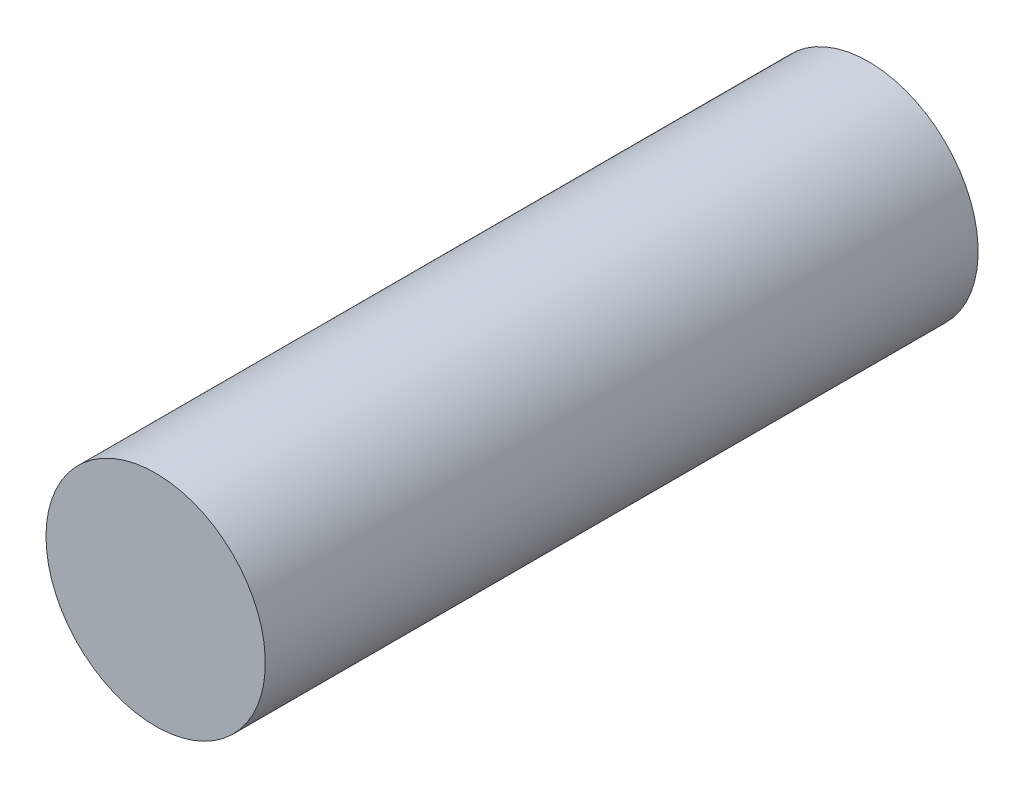
ISO-10303-21;
HEADER;
FILE_DESCRIPTION(('STEP AP214'),'2;1');
FILE_NAME('part.step','',(''),(''),'','','');
FILE_SCHEMA(('AUTOMOTIVE_DESIGN { 1 0 10303 214 1 1 1 1 }'));
ENDSEC;
DATA;
#1=APPLICATION_CONTEXT('core data for automotive mechanical design processes');
#2=APPLICATION_PROTOCOL_DEFINITION('international standard','automotive_design',2000,#1);
#3=PRODUCT_CONTEXT('',#1,'mechanical');
#4=PRODUCT('Part','Part','',(#3));
#5=PRODUCT_RELATED_PRODUCT_CATEGORY('part','',(#4));
#6=PRODUCT_DEFINITION_FORMATION('','',#4);
#7=PRODUCT_DEFINITION_CONTEXT('part definition',#1,'design');
#8=PRODUCT_DEFINITION('design','',#6,#7);
#9=PRODUCT_DEFINITION_SHAPE('','',#8);
#10=(LENGTH_UNIT() NAMED_UNIT(*) SI_UNIT(.MILLI.,.METRE.));
#11=(NAMED_UNIT(*) PLANE_ANGLE_UNIT() SI_UNIT($,.RADIAN.));
#12=(NAMED_UNIT(*) SI_UNIT($,.STERADIAN.) SOLID_ANGLE_UNIT());
#13=UNCERTAINTY_MEASURE_WITH_UNIT(LENGTH_MEASURE(1.E-05),#10,'distance_accuracy_value','');
#14=(GEOMETRIC_REPRESENTATION_CONTEXT(3) GLOBAL_UNCERTAINTY_ASSIGNED_CONTEXT((#13)) GLOBAL_UNIT_ASSIGNED_CONTEXT((#10,
#11,#12)) REPRESENTATION_CONTEXT('',''));
#15=CARTESIAN_POINT('',(0.,0.,0.));
#16=DIRECTION('',(0.,0.,1.));
#17=DIRECTION('',(1.,0.,0.));
#18=AXIS2_PLACEMENT_3D('',#15,#16,#17);
#19=CARTESIAN_POINT('',(0.,0.,26.));
#20=DIRECTION('',(0.,0.,-1.));
#21=DIRECTION('',(-1.,0.,0.));
#22=AXIS2_PLACEMENT_3D('',#19,#20,#21);
#23=CYLINDRICAL_SURFACE('',#22,4.);
#24=CARTESIAN_POINT('',(0.,0.,26.));
#25=DIRECTION('',(0.,0.,1.));
#26=DIRECTION('',(1.,0.,0.));
#27=AXIS2_PLACEMENT_3D('',#24,#25,#26);
#28=CIRCLE('',#27,4.);
#29=CARTESIAN_POINT('',(-4.,0.,26.));
#30=VERTEX_POINT('',#29);
#31=EDGE_CURVE('E10',#30,#30,#28,.T.);
#32=CARTESIAN_POINT('',(0.,0.,0.));
#33=DIRECTION('',(0.,0.,1.));
#34=DIRECTION('',(1.,0.,0.));
#35=AXIS2_PLACEMENT_3D('',#32,#33,#34);
#36=CIRCLE('',#35,4.);
#37=CARTESIAN_POINT('',(-4.,0.,0.));
#38=VERTEX_POINT('',#37);
#39=EDGE_CURVE('E39',#38,#38,#36,.T.);
#40=CARTESIAN_POINT('',(-4.,0.,26.));
#41=CARTESIAN_POINT('',(-4.,0.,25.7291666666667));
#42=CARTESIAN_POINT('',(-4.,0.,25.4583333333333));
#43=CARTESIAN_POINT('',(-4.,0.,24.9166666666667));
#44=CARTESIAN_POINT('',(-4.,0.,24.6458333333333));
#45=CARTESIAN_POINT('',(-4.,0.,24.1041666666667));
#46=CARTESIAN_POINT('',(-4.,0.,23.8333333333333));
#47=CARTESIAN_POINT('',(-4.,0.,23.2916666666667));
#48=CARTESIAN_POINT('',(-4.,0.,23.0208333333333));
#49=CARTESIAN_POINT('',(-4.,0.,22.4791666666667));
#50=CARTESIAN_POINT('',(-4.,0.,22.2083333333333));
#51=CARTESIAN_POINT('',(-4.,0.,21.6666666666667));
#52=CARTESIAN_POINT('',(-4.,0.,21.3958333333333));
#53=CARTESIAN_POINT('',(-4.,0.,20.8541666666667));
#54=CARTESIAN_POINT('',(-4.,0.,20.5833333333333));
#55=CARTESIAN_POINT('',(-4.,0.,20.0416666666667));
#56=CARTESIAN_POINT('',(-4.,0.,19.7708333333333));
#57=CARTESIAN_POINT('',(-4.,0.,19.2291666666667));
#58=CARTESIAN_POINT('',(-4.,0.,18.9583333333333));
#59=CARTESIAN_POINT('',(-4.,0.,18.4166666666667));
#60=CARTESIAN_POINT('',(-4.,0.,18.1458333333333));
#61=CARTESIAN_POINT('',(-4.,0.,17.6041666666667));
#62=CARTESIAN_POINT('',(-4.,0.,17.3333333333333));
#63=CARTESIAN_POINT('',(-4.,0.,16.7916666666667));
#64=CARTESIAN_POINT('',(-4.,0.,16.5208333333333));
#65=CARTESIAN_POINT('',(-4.,0.,15.9791666666667));
#66=CARTESIAN_POINT('',(-4.,0.,15.7083333333333));
#67=CARTESIAN_POINT('',(-4.,0.,15.1666666666667));
#68=CARTESIAN_POINT('',(-4.,0.,14.8958333333333));
#69=CARTESIAN_POINT('',(-4.,0.,14.3541666666667));
#70=CARTESIAN_POINT('',(-4.,0.,14.0833333333333));
#71=CARTESIAN_POINT('',(-4.,0.,13.5416666666667));
#72=CARTESIAN_POINT('',(-4.,0.,13.2708333333333));
#73=CARTESIAN_POINT('',(-4.,0.,12.7291666666667));
#74=CARTESIAN_POINT('',(-4.,0.,12.4583333333333));
#75=CARTESIAN_POINT('',(-4.,0.,11.9166666666667));
#76=CARTESIAN_POINT('',(-4.,0.,11.6458333333333));
#77=CARTESIAN_POINT('',(-4.,0.,11.1041666666667));
#78=CARTESIAN_POINT('',(-4.,0.,10.8333333333333));
#79=CARTESIAN_POINT('',(-4.,0.,10.2916666666667));
#80=CARTESIAN_POINT('',(-4.,0.,10.0208333333333));
#81=CARTESIAN_POINT('',(-4.,0.,9.47916666666667));
#82=CARTESIAN_POINT('',(-4.,0.,9.20833333333333));
#83=CARTESIAN_POINT('',(-4.,0.,8.66666666666667));
#84=CARTESIAN_POINT('',(-4.,0.,8.39583333333333));
#85=CARTESIAN_POINT('',(-4.,0.,7.85416666666667));
#86=CARTESIAN_POINT('',(-4.,0.,7.58333333333333));
#87=CARTESIAN_POINT('',(-4.,0.,7.04166666666667));
#88=CARTESIAN_POINT('',(-4.,0.,6.77083333333333));
#89=CARTESIAN_POINT('',(-4.,0.,6.22916666666667));
#90=CARTESIAN_POINT('',(-4.,0.,5.95833333333333));
#91=CARTESIAN_POINT('',(-4.,0.,5.41666666666667));
#92=CARTESIAN_POINT('',(-4.,0.,5.14583333333333));
#93=CARTESIAN_POINT('',(-4.,0.,4.60416666666667));
#94=CARTESIAN_POINT('',(-4.,0.,4.33333333333333));
#95=CARTESIAN_POINT('',(-4.,0.,3.79166666666667));
#96=CARTESIAN_POINT('',(-4.,0.,3.52083333333333));
#97=CARTESIAN_POINT('',(-4.,0.,2.97916666666667));
#98=CARTESIAN_POINT('',(-4.,0.,2.70833333333333));
#99=CARTESIAN_POINT('',(-4.,0.,2.16666666666667));
#100=CARTESIAN_POINT('',(-4.,0.,1.89583333333333));
#101=CARTESIAN_POINT('',(-4.,0.,1.35416666666667));
#102=CARTESIAN_POINT('',(-4.,0.,1.08333333333333));
#103=CARTESIAN_POINT('',(-4.,0.,0.541666666666667));
#104=CARTESIAN_POINT('',(-4.,0.,0.270833333333334));
#105=CARTESIAN_POINT('',(-4.,0.,0.));
#106=B_SPLINE_CURVE_WITH_KNOTS('',3,(#40,#41,#42,#43,#44,#45,#46,#47,#48,#49,#50,#51,#52,#53,
#54,#55,#56,#57,#58,#59,#60,#61,#62,#63,#64,#65,#66,#67,#68,#69,#70,#71,#72,#73,#74,#75,#76,#77,
#78,#79,#80,#81,#82,#83,#84,#85,#86,#87,#88,#89,#90,#91,#92,#93,#94,#95,#96,#97,#98,#99,#100,
#101,#102,#103,#104,#105),.UNSPECIFIED.,.F.,.F.,(4,2,2,2,2,2,2,2,2,2,2,2,2,2,2,2,2,2,2,2,2,2,2,
2,2,2,2,2,2,2,2,2,4),(0.,0.812500000000001,1.625,2.4375,3.25,4.0625,4.875,5.6875,6.5,7.3125,
8.125,8.9375,9.75,10.5625,11.375,12.1875,13.,13.8125,14.625,15.4375,16.25,17.0625,17.875,
18.6875,19.5,20.3125,21.125,21.9375,22.75,23.5625,24.375,25.1875,26.),.UNSPECIFIED.);
#107=EDGE_CURVE('BSEAM36',#30,#38,#106,.T.);
#108=ORIENTED_EDGE('',*,*,#31,.F.);
#109=ORIENTED_EDGE('',*,*,#39,.T.);
#110=ORIENTED_EDGE('',*,*,#107,.T.);
#111=ORIENTED_EDGE('',*,*,#107,.F.);
#112=EDGE_LOOP('',(#108,#110,#109,#111));
#113=FACE_BOUND('',#112,.T.);
#114=ADVANCED_FACE('F36',(#113),#23,.T.);
#115=CARTESIAN_POINT('',(0.,0.,26.));
#116=DIRECTION('',(0.,0.,1.));
#117=DIRECTION('',(1.,0.,0.));
#118=AXIS2_PLACEMENT_3D('',#115,#116,#117);
#119=PLANE('',#118);
#120=ORIENTED_EDGE('',*,*,#31,.T.);
#121=EDGE_LOOP('',(#120));
#122=FACE_BOUND('',#121,.T.);
#123=ADVANCED_FACE('F53',(#122),#119,.T.);
#124=CARTESIAN_POINT('',(0.,0.,0.));
#125=DIRECTION('',(0.,0.,1.));
#126=DIRECTION('',(1.,0.,0.));
#127=AXIS2_PLACEMENT_3D('',#124,#125,#126);
#128=PLANE('',#127);
#129=ORIENTED_EDGE('',*,*,#39,.F.);
#130=EDGE_LOOP('',(#129));
#131=FACE_BOUND('',#130,.T.);
#132=ADVANCED_FACE('F51',(#131),#128,.F.);
#133=CLOSED_SHELL('',(#114,#123,#132));
#134=MANIFOLD_SOLID_BREP('B2',#133);
#135=ADVANCED_BREP_SHAPE_REPRESENTATION('',(#18,#134),#14);
#136=SHAPE_DEFINITION_REPRESENTATION(#9,#135);
ENDSEC;
END-ISO-10303-21;
